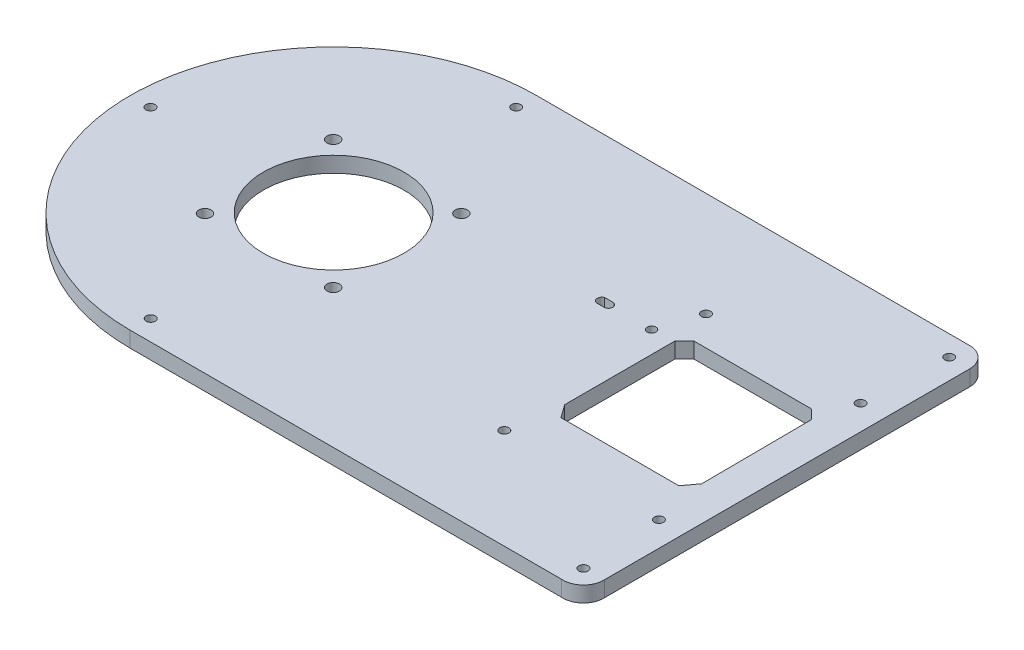
ISO-10303-21;
HEADER;
FILE_DESCRIPTION(('STEP AP214'),'2;1');
FILE_NAME('part.step','',(''),(''),'','','');
FILE_SCHEMA(('AUTOMOTIVE_DESIGN { 1 0 10303 214 1 1 1 1 }'));
ENDSEC;
DATA;
#1=APPLICATION_CONTEXT('core data for automotive mechanical design processes');
#2=APPLICATION_PROTOCOL_DEFINITION('international standard','automotive_design',2000,#1);
#3=PRODUCT_CONTEXT('',#1,'mechanical');
#4=PRODUCT('Part','Part','',(#3));
#5=PRODUCT_RELATED_PRODUCT_CATEGORY('part','',(#4));
#6=PRODUCT_DEFINITION_FORMATION('','',#4);
#7=PRODUCT_DEFINITION_CONTEXT('part definition',#1,'design');
#8=PRODUCT_DEFINITION('design','',#6,#7);
#9=PRODUCT_DEFINITION_SHAPE('','',#8);
#10=(LENGTH_UNIT() NAMED_UNIT(*) SI_UNIT(.MILLI.,.METRE.));
#11=(NAMED_UNIT(*) PLANE_ANGLE_UNIT() SI_UNIT($,.RADIAN.));
#12=(NAMED_UNIT(*) SI_UNIT($,.STERADIAN.) SOLID_ANGLE_UNIT());
#13=UNCERTAINTY_MEASURE_WITH_UNIT(LENGTH_MEASURE(1.E-05),#10,'distance_accuracy_value','');
#14=(GEOMETRIC_REPRESENTATION_CONTEXT(3) GLOBAL_UNCERTAINTY_ASSIGNED_CONTEXT((#13)) GLOBAL_UNIT_ASSIGNED_CONTEXT((#10,
#11,#12)) REPRESENTATION_CONTEXT('',''));
#15=CARTESIAN_POINT('',(0.,0.,0.));
#16=DIRECTION('',(0.,0.,1.));
#17=DIRECTION('',(1.,0.,0.));
#18=AXIS2_PLACEMENT_3D('',#15,#16,#17);
#19=CARTESIAN_POINT('',(-52.2020388860603,5.,3.91732283464572));
#20=DIRECTION('',(0.,-1.,0.));
#21=DIRECTION('',(0.,0.,-1.));
#22=AXIS2_PLACEMENT_3D('',#19,#20,#21);
#23=CYLINDRICAL_SURFACE('',#22,65.);
#24=CARTESIAN_POINT('',(-52.2020388860603,0.,3.91732283464572));
#25=DIRECTION('',(0.,1.,0.));
#26=DIRECTION('',(0.,0.,1.));
#27=AXIS2_PLACEMENT_3D('',#24,#25,#26);
#28=CIRCLE('',#27,65.);
#29=CARTESIAN_POINT('',(-52.2020388860603,0.,-61.0826771653543));
#30=VERTEX_POINT('',#29);
#31=CARTESIAN_POINT('',(-52.2020388860603,0.,68.9173228346457));
#32=VERTEX_POINT('',#31);
#33=EDGE_CURVE('E274',#30,#32,#28,.T.);
#34=ORIENTED_EDGE('',*,*,#33,.T.);
#35=DIRECTION('',(0.,-1.,0.));
#36=VECTOR('',#35,1.);
#37=CARTESIAN_POINT('',(-52.2020388860603,5.,68.9173228346457));
#38=LINE('',#37,#36);
#39=CARTESIAN_POINT('',(-52.2020388860603,5.,68.9173228346457));
#40=VERTEX_POINT('',#39);
#41=EDGE_CURVE('E11',#40,#32,#38,.T.);
#42=ORIENTED_EDGE('',*,*,#41,.F.);
#43=CARTESIAN_POINT('',(-52.2020388860603,5.,3.91732283464572));
#44=DIRECTION('',(0.,1.,0.));
#45=DIRECTION('',(0.,0.,1.));
#46=AXIS2_PLACEMENT_3D('',#43,#44,#45);
#47=CIRCLE('',#46,65.);
#48=CARTESIAN_POINT('',(-52.2020388860603,5.,-61.0826771653543));
#49=VERTEX_POINT('',#48);
#50=EDGE_CURVE('E277',#49,#40,#47,.T.);
#51=ORIENTED_EDGE('',*,*,#50,.F.);
#52=DIRECTION('',(0.,-1.,0.));
#53=VECTOR('',#52,1.);
#54=CARTESIAN_POINT('',(-52.2020388860603,5.,-61.0826771653543));
#55=LINE('',#54,#53);
#56=EDGE_CURVE('E291',#49,#30,#55,.T.);
#57=ORIENTED_EDGE('',*,*,#56,.T.);
#58=EDGE_LOOP('',(#34,#42,#51,#57));
#59=FACE_BOUND('',#58,.T.);
#60=ADVANCED_FACE('F36',(#59),#23,.T.);
#61=CARTESIAN_POINT('',(85.7979611139397,5.,68.9173228346457));
#62=DIRECTION('',(0.,0.,-1.));
#63=DIRECTION('',(-1.,0.,0.));
#64=AXIS2_PLACEMENT_3D('',#61,#62,#63);
#65=PLANE('',#64);
#66=DIRECTION('',(1.,0.,0.));
#67=VECTOR('',#66,1.);
#68=CARTESIAN_POINT('',(85.7979611139397,0.,68.9173228346457));
#69=LINE('',#68,#67);
#70=CARTESIAN_POINT('',(85.7979611139397,0.,68.9173228346457));
#71=VERTEX_POINT('',#70);
#72=EDGE_CURVE('E294',#32,#71,#69,.T.);
#73=ORIENTED_EDGE('',*,*,#72,.T.);
#74=DIRECTION('',(0.,-1.,0.));
#75=VECTOR('',#74,1.);
#76=CARTESIAN_POINT('',(85.7979611139397,5.,68.9173228346457));
#77=LINE('',#76,#75);
#78=CARTESIAN_POINT('',(85.7979611139397,5.,68.9173228346457));
#79=VERTEX_POINT('',#78);
#80=EDGE_CURVE('E43',#79,#71,#77,.T.);
#81=ORIENTED_EDGE('',*,*,#80,.F.);
#82=DIRECTION('',(1.,0.,0.));
#83=VECTOR('',#82,1.);
#84=CARTESIAN_POINT('',(85.7979611139397,5.,68.9173228346457));
#85=LINE('',#84,#83);
#86=EDGE_CURVE('E280',#40,#79,#85,.T.);
#87=ORIENTED_EDGE('',*,*,#86,.F.);
#88=ORIENTED_EDGE('',*,*,#41,.T.);
#89=EDGE_LOOP('',(#73,#81,#87,#88));
#90=FACE_BOUND('',#89,.T.);
#91=ADVANCED_FACE('F340',(#90),#65,.F.);
#92=CARTESIAN_POINT('',(86.2995932589379,5.,62.4357482206261));
#93=DIRECTION('',(0.,-1.,0.));
#94=DIRECTION('',(0.,0.,-1.));
#95=AXIS2_PLACEMENT_3D('',#92,#93,#94);
#96=CYLINDRICAL_SURFACE('',#95,6.50095718229236);
#97=CARTESIAN_POINT('',(86.2995932589379,0.,62.4357482206261));
#98=DIRECTION('',(0.,1.,0.));
#99=DIRECTION('',(0.,0.,-1.));
#100=AXIS2_PLACEMENT_3D('',#97,#98,#99);
#101=CIRCLE('',#100,6.50095718229236);
#102=CARTESIAN_POINT('',(92.7979611139396,0.,62.2522829457677));
#103=VERTEX_POINT('',#102);
#104=EDGE_CURVE('E296',#71,#103,#101,.T.);
#105=ORIENTED_EDGE('',*,*,#104,.T.);
#106=DIRECTION('',(0.,-1.,0.));
#107=VECTOR('',#106,1.);
#108=CARTESIAN_POINT('',(92.7979611139396,5.,62.2522829457677));
#109=LINE('',#108,#107);
#110=CARTESIAN_POINT('',(92.7979611139396,5.,62.2522829457677));
#111=VERTEX_POINT('',#110);
#112=EDGE_CURVE('E311',#111,#103,#109,.T.);
#113=ORIENTED_EDGE('',*,*,#112,.F.);
#114=CARTESIAN_POINT('',(86.2995932589379,5.,62.4357482206261));
#115=DIRECTION('',(0.,1.,0.));
#116=DIRECTION('',(0.,0.,-1.));
#117=AXIS2_PLACEMENT_3D('',#114,#115,#116);
#118=CIRCLE('',#117,6.50095718229236);
#119=EDGE_CURVE('E283',#79,#111,#118,.T.);
#120=ORIENTED_EDGE('',*,*,#119,.F.);
#121=ORIENTED_EDGE('',*,*,#80,.T.);
#122=EDGE_LOOP('',(#105,#113,#120,#121));
#123=FACE_BOUND('',#122,.T.);
#124=ADVANCED_FACE('F318',(#123),#96,.T.);
#125=CARTESIAN_POINT('',(92.7979611139396,5.,-54.7477170542323));
#126=DIRECTION('',(-1.,0.,0.));
#127=DIRECTION('',(0.,0.,1.));
#128=AXIS2_PLACEMENT_3D('',#125,#126,#127);
#129=PLANE('',#128);
#130=DIRECTION('',(0.,0.,-1.));
#131=VECTOR('',#130,1.);
#132=CARTESIAN_POINT('',(92.7979611139396,0.,-54.7477170542323));
#133=LINE('',#132,#131);
#134=CARTESIAN_POINT('',(92.7979611139396,0.,-54.7477170542323));
#135=VERTEX_POINT('',#134);
#136=EDGE_CURVE('E298',#103,#135,#133,.T.);
#137=ORIENTED_EDGE('',*,*,#136,.T.);
#138=DIRECTION('',(0.,-1.,0.));
#139=VECTOR('',#138,1.);
#140=CARTESIAN_POINT('',(92.7979611139396,5.,-54.7477170542323));
#141=LINE('',#140,#139);
#142=CARTESIAN_POINT('',(92.7979611139396,5.,-54.7477170542323));
#143=VERTEX_POINT('',#142);
#144=EDGE_CURVE('E308',#143,#135,#141,.T.);
#145=ORIENTED_EDGE('',*,*,#144,.F.);
#146=DIRECTION('',(0.,0.,-1.));
#147=VECTOR('',#146,1.);
#148=CARTESIAN_POINT('',(92.7979611139396,5.,-54.7477170542323));
#149=LINE('',#148,#147);
#150=EDGE_CURVE('E285',#111,#143,#149,.T.);
#151=ORIENTED_EDGE('',*,*,#150,.F.);
#152=ORIENTED_EDGE('',*,*,#112,.T.);
#153=EDGE_LOOP('',(#137,#145,#151,#152));
#154=FACE_BOUND('',#153,.T.);
#155=ADVANCED_FACE('F329',(#154),#129,.F.);
#156=CARTESIAN_POINT('',(86.299593258938,5.,-54.6020625964184));
#157=DIRECTION('',(0.,-1.,0.));
#158=DIRECTION('',(0.,0.,-1.));
#159=AXIS2_PLACEMENT_3D('',#156,#157,#158);
#160=CYLINDRICAL_SURFACE('',#159,6.50000000000001);
#161=CARTESIAN_POINT('',(86.299593258938,0.,-54.6020625964184));
#162=DIRECTION('',(0.,1.,0.));
#163=DIRECTION('',(0.,0.,-1.));
#164=AXIS2_PLACEMENT_3D('',#161,#162,#163);
#165=CIRCLE('',#164,6.50000000000001);
#166=CARTESIAN_POINT('',(85.7979611139397,0.,-61.0826771653543));
#167=VERTEX_POINT('',#166);
#168=EDGE_CURVE('E300',#135,#167,#165,.T.);
#169=ORIENTED_EDGE('',*,*,#168,.T.);
#170=DIRECTION('',(0.,-1.,0.));
#171=VECTOR('',#170,1.);
#172=CARTESIAN_POINT('',(85.7979611139397,5.,-61.0826771653543));
#173=LINE('',#172,#171);
#174=CARTESIAN_POINT('',(85.7979611139397,5.,-61.0826771653543));
#175=VERTEX_POINT('',#174);
#176=EDGE_CURVE('E305',#175,#167,#173,.T.);
#177=ORIENTED_EDGE('',*,*,#176,.F.);
#178=CARTESIAN_POINT('',(86.299593258938,5.,-54.6020625964184));
#179=DIRECTION('',(0.,1.,0.));
#180=DIRECTION('',(0.,0.,-1.));
#181=AXIS2_PLACEMENT_3D('',#178,#179,#180);
#182=CIRCLE('',#181,6.50000000000001);
#183=EDGE_CURVE('E287',#143,#175,#182,.T.);
#184=ORIENTED_EDGE('',*,*,#183,.F.);
#185=ORIENTED_EDGE('',*,*,#144,.T.);
#186=EDGE_LOOP('',(#169,#177,#184,#185));
#187=FACE_BOUND('',#186,.T.);
#188=ADVANCED_FACE('F333',(#187),#160,.T.);
#189=CARTESIAN_POINT('',(-52.2020388860603,5.,-61.0826771653543));
#190=DIRECTION('',(0.,0.,1.));
#191=DIRECTION('',(1.,0.,0.));
#192=AXIS2_PLACEMENT_3D('',#189,#190,#191);
#193=PLANE('',#192);
#194=DIRECTION('',(-1.,0.,0.));
#195=VECTOR('',#194,1.);
#196=CARTESIAN_POINT('',(-52.2020388860603,0.,-61.0826771653543));
#197=LINE('',#196,#195);
#198=EDGE_CURVE('E281',#167,#30,#197,.T.);
#199=ORIENTED_EDGE('',*,*,#198,.T.);
#200=ORIENTED_EDGE('',*,*,#56,.F.);
#201=DIRECTION('',(-1.,0.,0.));
#202=VECTOR('',#201,1.);
#203=CARTESIAN_POINT('',(-52.2020388860603,5.,-61.0826771653543));
#204=LINE('',#203,#202);
#205=EDGE_CURVE('E289',#175,#49,#204,.T.);
#206=ORIENTED_EDGE('',*,*,#205,.F.);
#207=ORIENTED_EDGE('',*,*,#176,.T.);
#208=EDGE_LOOP('',(#199,#200,#206,#207));
#209=FACE_BOUND('',#208,.T.);
#210=ADVANCED_FACE('F343',(#209),#193,.F.);
#211=CARTESIAN_POINT('',(-52.2020388860603,5.,3.91732283464572));
#212=DIRECTION('',(0.,1.,0.));
#213=DIRECTION('',(0.,0.,1.));
#214=AXIS2_PLACEMENT_3D('',#211,#212,#213);
#215=PLANE('',#214);
#216=CARTESIAN_POINT('',(84.8753715396268,5.,-27.6766639196561));
#217=DIRECTION('',(0.,1.,0.));
#218=DIRECTION('',(0.,0.,-1.));
#219=AXIS2_PLACEMENT_3D('',#216,#217,#218);
#220=CIRCLE('',#219,1.475);
#221=CARTESIAN_POINT('',(84.8753715396268,5.,-29.1516639196561));
#222=VERTEX_POINT('',#221);
#223=EDGE_CURVE('E749',#222,#222,#220,.T.);
#224=ORIENTED_EDGE('',*,*,#223,.F.);
#225=EDGE_LOOP('',(#224));
#226=FACE_BOUND('',#225,.T.);
#227=CARTESIAN_POINT('',(35.4096421433843,5.,-27.6766639196561));
#228=DIRECTION('',(0.,1.,0.));
#229=DIRECTION('',(0.,0.,1.));
#230=AXIS2_PLACEMENT_3D('',#227,#228,#229);
#231=CIRCLE('',#230,1.475);
#232=CARTESIAN_POINT('',(35.4096421433843,5.,-26.2016639196561));
#233=VERTEX_POINT('',#232);
#234=EDGE_CURVE('E753',#233,#233,#231,.T.);
#235=ORIENTED_EDGE('',*,*,#234,.F.);
#236=EDGE_LOOP('',(#235));
#237=FACE_BOUND('',#236,.T.);
#238=CARTESIAN_POINT('',(-31.529119458978,5.,24.6429681159831));
#239=DIRECTION('',(0.,1.,0.));
#240=DIRECTION('',(0.,0.,-1.));
#241=AXIS2_PLACEMENT_3D('',#238,#239,#240);
#242=CIRCLE('',#241,1.975);
#243=CARTESIAN_POINT('',(-31.529119458978,5.,22.6679681159831));
#244=VERTEX_POINT('',#243);
#245=EDGE_CURVE('E866',#244,#244,#242,.T.);
#246=ORIENTED_EDGE('',*,*,#245,.F.);
#247=EDGE_LOOP('',(#246));
#248=FACE_BOUND('',#247,.T.);
#249=CARTESIAN_POINT('',(-72.5383888478526,5.,24.6429681159831));
#250=DIRECTION('',(0.,1.,0.));
#251=DIRECTION('',(0.,0.,1.));
#252=AXIS2_PLACEMENT_3D('',#249,#250,#251);
#253=CIRCLE('',#252,1.97500000000001);
#254=CARTESIAN_POINT('',(-72.5383888478526,5.,26.6179681159831));
#255=VERTEX_POINT('',#254);
#256=EDGE_CURVE('E770',#255,#255,#253,.T.);
#257=ORIENTED_EDGE('',*,*,#256,.F.);
#258=EDGE_LOOP('',(#257));
#259=FACE_BOUND('',#258,.T.);
#260=DIRECTION('',(-0.708375142046646,0.,0.705836141133616));
#261=VECTOR('',#260,1.);
#262=CARTESIAN_POINT('',(37.9384394620157,5.,-15.2484976303887));
#263=LINE('',#262,#261);
#264=CARTESIAN_POINT('',(40.9384394620157,5.,-18.2377448494299));
#265=VERTEX_POINT('',#264);
#266=CARTESIAN_POINT('',(37.9384394620157,5.,-15.2484976303887));
#267=VERTEX_POINT('',#266);
#268=EDGE_CURVE('E50',#265,#267,#263,.T.);
#269=ORIENTED_EDGE('',*,*,#268,.F.);
#270=DIRECTION('',(-1.,0.,0.));
#271=VECTOR('',#270,1.);
#272=CARTESIAN_POINT('',(40.9384394620157,5.,-18.2377448494299));
#273=LINE('',#272,#271);
#274=CARTESIAN_POINT('',(78.6574827658638,5.,-18.2377448494299));
#275=VERTEX_POINT('',#274);
#276=EDGE_CURVE('E170',#275,#265,#273,.T.);
#277=ORIENTED_EDGE('',*,*,#276,.F.);
#278=DIRECTION('',(-0.694468442184664,0.,-0.719523163497608));
#279=VECTOR('',#278,1.);
#280=CARTESIAN_POINT('',(78.6574827658638,5.,-18.2377448494299));
#281=LINE('',#280,#279);
#282=CARTESIAN_POINT('',(81.5426405548378,5.,-15.2484976303887));
#283=VERTEX_POINT('',#282);
#284=EDGE_CURVE('E175',#283,#275,#281,.T.);
#285=ORIENTED_EDGE('',*,*,#284,.F.);
#286=DIRECTION('',(-0.00650489892875077,0.,-0.999978842921152));
#287=VECTOR('',#286,1.);
#288=CARTESIAN_POINT('',(81.5426405548378,5.,-15.2484976303887));
#289=LINE('',#288,#287);
#290=CARTESIAN_POINT('',(81.7723249768897,5.,20.0602081798352));
#291=VERTEX_POINT('',#290);
#292=EDGE_CURVE('E784',#291,#283,#289,.T.);
#293=ORIENTED_EDGE('',*,*,#292,.F.);
#294=DIRECTION('',(0.595500929355019,0.,-0.803354618544829));
#295=VECTOR('',#294,1.);
#296=CARTESIAN_POINT('',(81.7723249768897,5.,20.0602081798352));
#297=LINE('',#296,#295);
#298=CARTESIAN_POINT('',(78.6574827658638,5.,24.2622551505701));
#299=VERTEX_POINT('',#298);
#300=EDGE_CURVE('E787',#299,#291,#297,.T.);
#301=ORIENTED_EDGE('',*,*,#300,.F.);
#302=DIRECTION('',(1.,0.,0.));
#303=VECTOR('',#302,1.);
#304=CARTESIAN_POINT('',(40.9384394620156,5.,24.2622551505701));
#305=LINE('',#304,#303);
#306=CARTESIAN_POINT('',(40.9384394620156,5.,24.2622551505701));
#307=VERTEX_POINT('',#306);
#308=EDGE_CURVE('E790',#307,#299,#305,.T.);
#309=ORIENTED_EDGE('',*,*,#308,.F.);
#310=DIRECTION('',(0.581050661261784,0.,0.813867390332875));
#311=VECTOR('',#310,1.);
#312=CARTESIAN_POINT('',(40.9384394620156,5.,24.2622551505701));
#313=LINE('',#312,#311);
#314=CARTESIAN_POINT('',(37.9384394620157,5.,20.0602081798352));
#315=VERTEX_POINT('',#314);
#316=EDGE_CURVE('E186',#315,#307,#313,.T.);
#317=ORIENTED_EDGE('',*,*,#316,.F.);
#318=DIRECTION('',(0.,0.,1.));
#319=VECTOR('',#318,1.);
#320=CARTESIAN_POINT('',(37.9384394620157,5.,-15.2484976303887));
#321=LINE('',#320,#319);
#322=EDGE_CURVE('E182',#267,#315,#321,.T.);
#323=ORIENTED_EDGE('',*,*,#322,.F.);
#324=EDGE_LOOP('',(#269,#277,#285,#293,#301,#309,#317,#323));
#325=FACE_BOUND('',#324,.T.);
#326=CARTESIAN_POINT('',(-52.2020388860603,5.,3.82202397280545));
#327=DIRECTION('',(0.,1.,0.));
#328=DIRECTION('',(0.,0.,1.));
#329=AXIS2_PLACEMENT_3D('',#326,#327,#328);
#330=CIRCLE('',#329,22.5);
#331=CARTESIAN_POINT('',(-52.2020388860603,5.,26.3220239728055));
#332=VERTEX_POINT('',#331);
#333=EDGE_CURVE('E167',#332,#332,#330,.T.);
#334=ORIENTED_EDGE('',*,*,#333,.F.);
#335=EDGE_LOOP('',(#334));
#336=FACE_BOUND('',#335,.T.);
#337=CARTESIAN_POINT('',(-72.5387541534153,5.,-16.3670318823898));
#338=DIRECTION('',(0.,1.,0.));
#339=DIRECTION('',(0.,0.,1.));
#340=AXIS2_PLACEMENT_3D('',#337,#338,#339);
#341=CIRCLE('',#340,1.97500000000001);
#342=CARTESIAN_POINT('',(-72.5387541534153,5.,-14.3920318823898));
#343=VERTEX_POINT('',#342);
#344=EDGE_CURVE('E217',#343,#343,#341,.T.);
#345=ORIENTED_EDGE('',*,*,#344,.F.);
#346=EDGE_LOOP('',(#345));
#347=FACE_BOUND('',#346,.T.);
#348=CARTESIAN_POINT('',(31.0479611139397,5.,-14.6279760271946));
#349=DIRECTION('',(0.,1.,0.));
#350=DIRECTION('',(0.,0.,1.));
#351=AXIS2_PLACEMENT_3D('',#348,#349,#350);
#352=CIRCLE('',#351,1.39999999999999);
#353=CARTESIAN_POINT('',(31.0479611139397,5.,-13.2279760271946));
#354=VERTEX_POINT('',#353);
#355=EDGE_CURVE('E764',#354,#354,#352,.T.);
#356=ORIENTED_EDGE('',*,*,#355,.F.);
#357=EDGE_LOOP('',(#356));
#358=FACE_BOUND('',#357,.T.);
#359=CARTESIAN_POINT('',(84.8753715396268,5.,36.8488392095397));
#360=DIRECTION('',(0.,1.,0.));
#361=DIRECTION('',(0.,0.,1.));
#362=AXIS2_PLACEMENT_3D('',#359,#360,#361);
#363=CIRCLE('',#362,1.475);
#364=CARTESIAN_POINT('',(84.8753715396268,5.,38.3238392095397));
#365=VERTEX_POINT('',#364);
#366=EDGE_CURVE('E755',#365,#365,#363,.T.);
#367=ORIENTED_EDGE('',*,*,#366,.F.);
#368=EDGE_LOOP('',(#367));
#369=FACE_BOUND('',#368,.T.);
#370=CARTESIAN_POINT('',(35.4096421433843,5.,36.8488392095397));
#371=DIRECTION('',(0.,1.,0.));
#372=DIRECTION('',(0.,0.,-1.));
#373=AXIS2_PLACEMENT_3D('',#370,#371,#372);
#374=CIRCLE('',#373,1.475);
#375=CARTESIAN_POINT('',(35.4096421433843,5.,35.3738392095398));
#376=VERTEX_POINT('',#375);
#377=EDGE_CURVE('E886',#376,#376,#374,.T.);
#378=ORIENTED_EDGE('',*,*,#377,.F.);
#379=EDGE_LOOP('',(#378));
#380=FACE_BOUND('',#379,.T.);
#381=CARTESIAN_POINT('',(-31.5287541534153,5.,-16.3670318823899));
#382=DIRECTION('',(0.,1.,0.));
#383=DIRECTION('',(0.,0.,-1.));
#384=AXIS2_PLACEMENT_3D('',#381,#382,#383);
#385=CIRCLE('',#384,1.975);
#386=CARTESIAN_POINT('',(-31.5287541534153,5.,-18.3420318823899));
#387=VERTEX_POINT('',#386);
#388=EDGE_CURVE('E855',#387,#387,#385,.T.);
#389=ORIENTED_EDGE('',*,*,#388,.F.);
#390=EDGE_LOOP('',(#389));
#391=FACE_BOUND('',#390,.T.);
#392=CARTESIAN_POINT('',(17.235221732455,5.,-14.6279760271946));
#393=DIRECTION('',(0.,1.,0.));
#394=DIRECTION('',(0.,0.,-1.));
#395=AXIS2_PLACEMENT_3D('',#392,#393,#394);
#396=CIRCLE('',#395,1.41607134157657);
#397=CARTESIAN_POINT('',(17.4479611139397,5.,-13.2279760271946));
#398=VERTEX_POINT('',#397);
#399=CARTESIAN_POINT('',(17.4479611139397,5.,-16.0279760271946));
#400=VERTEX_POINT('',#399);
#401=EDGE_CURVE('E58',#398,#400,#396,.T.);
#402=ORIENTED_EDGE('',*,*,#401,.F.);
#403=DIRECTION('',(1.,0.,0.));
#404=VECTOR('',#403,1.);
#405=CARTESIAN_POINT('',(17.4479611139397,5.,-13.2279760271946));
#406=LINE('',#405,#404);
#407=CARTESIAN_POINT('',(14.6479611139397,5.,-13.2279760271946));
#408=VERTEX_POINT('',#407);
#409=EDGE_CURVE('E222',#408,#398,#406,.T.);
#410=ORIENTED_EDGE('',*,*,#409,.F.);
#411=CARTESIAN_POINT('',(15.1916657780671,5.,-14.6279760271946));
#412=DIRECTION('',(0.,1.,0.));
#413=DIRECTION('',(0.,0.,1.));
#414=AXIS2_PLACEMENT_3D('',#411,#412,#413);
#415=CIRCLE('',#414,1.50187042110624);
#416=CARTESIAN_POINT('',(14.6479611139397,5.,-16.0279760271946));
#417=VERTEX_POINT('',#416);
#418=EDGE_CURVE('E234',#417,#408,#415,.T.);
#419=ORIENTED_EDGE('',*,*,#418,.F.);
#420=DIRECTION('',(-1.,0.,0.));
#421=VECTOR('',#420,1.);
#422=CARTESIAN_POINT('',(17.4479611139397,5.,-16.0279760271945));
#423=LINE('',#422,#421);
#424=EDGE_CURVE('E184',#400,#417,#423,.T.);
#425=ORIENTED_EDGE('',*,*,#424,.F.);
#426=EDGE_LOOP('',(#402,#410,#419,#425));
#427=FACE_BOUND('',#426,.T.);
#428=CARTESIAN_POINT('',(-52.1101684414819,5.,62.4173228346457));
#429=DIRECTION('',(0.,1.,0.));
#430=DIRECTION('',(0.,0.,-1.));
#431=AXIS2_PLACEMENT_3D('',#428,#429,#430);
#432=CIRCLE('',#431,1.475);
#433=CARTESIAN_POINT('',(-52.1101684414819,5.,60.9423228346457));
#434=VERTEX_POINT('',#433);
#435=EDGE_CURVE('E266',#434,#434,#432,.T.);
#436=ORIENTED_EDGE('',*,*,#435,.F.);
#437=EDGE_LOOP('',(#436));
#438=FACE_BOUND('',#437,.T.);
#439=CARTESIAN_POINT('',(86.2979611139396,5.,62.4173228346457));
#440=DIRECTION('',(0.,1.,0.));
#441=DIRECTION('',(0.,0.,-1.));
#442=AXIS2_PLACEMENT_3D('',#439,#440,#441);
#443=CIRCLE('',#442,1.475);
#444=CARTESIAN_POINT('',(86.2979611139396,5.,60.9423228346457));
#445=VERTEX_POINT('',#444);
#446=EDGE_CURVE('E260',#445,#445,#443,.T.);
#447=ORIENTED_EDGE('',*,*,#446,.F.);
#448=EDGE_LOOP('',(#447));
#449=FACE_BOUND('',#448,.T.);
#450=CARTESIAN_POINT('',(-110.70203888606,5.,3.91221445713284));
#451=DIRECTION('',(0.,1.,0.));
#452=DIRECTION('',(0.,0.,1.));
#453=AXIS2_PLACEMENT_3D('',#450,#451,#452);
#454=CIRCLE('',#453,1.475);
#455=CARTESIAN_POINT('',(-110.70203888606,5.,5.38721445713284));
#456=VERTEX_POINT('',#455);
#457=EDGE_CURVE('E254',#456,#456,#454,.T.);
#458=ORIENTED_EDGE('',*,*,#457,.F.);
#459=EDGE_LOOP('',(#458));
#460=FACE_BOUND('',#459,.T.);
#461=CARTESIAN_POINT('',(-52.2020388860604,5.,-54.5826771653543));
#462=DIRECTION('',(0.,1.,0.));
#463=DIRECTION('',(0.,0.,1.));
#464=AXIS2_PLACEMENT_3D('',#461,#462,#463);
#465=CIRCLE('',#464,1.475);
#466=CARTESIAN_POINT('',(-52.2020388860604,5.,-53.1076771653543));
#467=VERTEX_POINT('',#466);
#468=EDGE_CURVE('E247',#467,#467,#465,.T.);
#469=ORIENTED_EDGE('',*,*,#468,.F.);
#470=EDGE_LOOP('',(#469));
#471=FACE_BOUND('',#470,.T.);
#472=CARTESIAN_POINT('',(86.2979611139396,5.,-54.5826771653543));
#473=DIRECTION('',(0.,1.,0.));
#474=DIRECTION('',(0.,0.,1.));
#475=AXIS2_PLACEMENT_3D('',#472,#473,#474);
#476=CIRCLE('',#475,1.475);
#477=CARTESIAN_POINT('',(86.2979611139396,5.,-53.1076771653543));
#478=VERTEX_POINT('',#477);
#479=EDGE_CURVE('E250',#478,#478,#476,.T.);
#480=ORIENTED_EDGE('',*,*,#479,.F.);
#481=EDGE_LOOP('',(#480));
#482=FACE_BOUND('',#481,.T.);
#483=ORIENTED_EDGE('',*,*,#50,.T.);
#484=ORIENTED_EDGE('',*,*,#86,.T.);
#485=ORIENTED_EDGE('',*,*,#119,.T.);
#486=ORIENTED_EDGE('',*,*,#150,.T.);
#487=ORIENTED_EDGE('',*,*,#183,.T.);
#488=ORIENTED_EDGE('',*,*,#205,.T.);
#489=EDGE_LOOP('',(#483,#484,#485,#486,#487,#488));
#490=FACE_BOUND('',#489,.T.);
#491=ADVANCED_FACE('F178',(#226,#237,#248,#259,#325,#336,#347,#358,#369,#380,#391,#427,#438,
#449,#460,#471,#482,#490),#215,.T.);
#492=CARTESIAN_POINT('',(-52.2020388860603,0.,3.91732283464572));
#493=DIRECTION('',(0.,1.,0.));
#494=DIRECTION('',(0.,0.,1.));
#495=AXIS2_PLACEMENT_3D('',#492,#493,#494);
#496=PLANE('',#495);
#497=CARTESIAN_POINT('',(84.8753715396268,0.,-27.6766639196561));
#498=DIRECTION('',(0.,1.,0.));
#499=DIRECTION('',(0.,0.,-1.));
#500=AXIS2_PLACEMENT_3D('',#497,#498,#499);
#501=CIRCLE('',#500,1.475);
#502=CARTESIAN_POINT('',(84.8753715396268,0.,-29.1516639196561));
#503=VERTEX_POINT('',#502);
#504=EDGE_CURVE('E746',#503,#503,#501,.T.);
#505=ORIENTED_EDGE('',*,*,#504,.T.);
#506=EDGE_LOOP('',(#505));
#507=FACE_BOUND('',#506,.T.);
#508=CARTESIAN_POINT('',(35.4096421433843,0.,-27.6766639196561));
#509=DIRECTION('',(0.,1.,0.));
#510=DIRECTION('',(0.,0.,1.));
#511=AXIS2_PLACEMENT_3D('',#508,#509,#510);
#512=CIRCLE('',#511,1.475);
#513=CARTESIAN_POINT('',(35.4096421433843,0.,-26.2016639196561));
#514=VERTEX_POINT('',#513);
#515=EDGE_CURVE('E750',#514,#514,#512,.T.);
#516=ORIENTED_EDGE('',*,*,#515,.T.);
#517=EDGE_LOOP('',(#516));
#518=FACE_BOUND('',#517,.T.);
#519=CARTESIAN_POINT('',(-31.529119458978,0.,24.6429681159831));
#520=DIRECTION('',(0.,1.,0.));
#521=DIRECTION('',(0.,0.,-1.));
#522=AXIS2_PLACEMENT_3D('',#519,#520,#521);
#523=CIRCLE('',#522,1.975);
#524=CARTESIAN_POINT('',(-31.529119458978,0.,22.6679681159831));
#525=VERTEX_POINT('',#524);
#526=EDGE_CURVE('E869',#525,#525,#523,.T.);
#527=ORIENTED_EDGE('',*,*,#526,.T.);
#528=EDGE_LOOP('',(#527));
#529=FACE_BOUND('',#528,.T.);
#530=CARTESIAN_POINT('',(-72.5383888478526,0.,24.6429681159831));
#531=DIRECTION('',(0.,1.,0.));
#532=DIRECTION('',(0.,0.,1.));
#533=AXIS2_PLACEMENT_3D('',#530,#531,#532);
#534=CIRCLE('',#533,1.97500000000001);
#535=CARTESIAN_POINT('',(-72.5383888478526,0.,26.6179681159831));
#536=VERTEX_POINT('',#535);
#537=EDGE_CURVE('E863',#536,#536,#534,.T.);
#538=ORIENTED_EDGE('',*,*,#537,.T.);
#539=EDGE_LOOP('',(#538));
#540=FACE_BOUND('',#539,.T.);
#541=DIRECTION('',(-1.,0.,0.));
#542=VECTOR('',#541,1.);
#543=CARTESIAN_POINT('',(40.9384394620157,0.,-18.2377448494299));
#544=LINE('',#543,#542);
#545=CARTESIAN_POINT('',(78.6574827658638,0.,-18.2377448494299));
#546=VERTEX_POINT('',#545);
#547=CARTESIAN_POINT('',(40.9384394620157,0.,-18.2377448494299));
#548=VERTEX_POINT('',#547);
#549=EDGE_CURVE('E190',#546,#548,#544,.T.);
#550=ORIENTED_EDGE('',*,*,#549,.T.);
#551=DIRECTION('',(-0.708375142046646,0.,0.705836141133616));
#552=VECTOR('',#551,1.);
#553=CARTESIAN_POINT('',(37.9384394620157,0.,-15.2484976303887));
#554=LINE('',#553,#552);
#555=CARTESIAN_POINT('',(37.9384394620157,0.,-15.2484976303887));
#556=VERTEX_POINT('',#555);
#557=EDGE_CURVE('E162',#548,#556,#554,.T.);
#558=ORIENTED_EDGE('',*,*,#557,.T.);
#559=DIRECTION('',(0.,0.,1.));
#560=VECTOR('',#559,1.);
#561=CARTESIAN_POINT('',(37.9384394620157,0.,-15.2484976303887));
#562=LINE('',#561,#560);
#563=CARTESIAN_POINT('',(37.9384394620157,0.,20.0602081798352));
#564=VERTEX_POINT('',#563);
#565=EDGE_CURVE('E208',#556,#564,#562,.T.);
#566=ORIENTED_EDGE('',*,*,#565,.T.);
#567=DIRECTION('',(0.581050661261784,0.,0.813867390332875));
#568=VECTOR('',#567,1.);
#569=CARTESIAN_POINT('',(40.9384394620156,0.,24.2622551505701));
#570=LINE('',#569,#568);
#571=CARTESIAN_POINT('',(40.9384394620156,0.,24.2622551505701));
#572=VERTEX_POINT('',#571);
#573=EDGE_CURVE('E205',#564,#572,#570,.T.);
#574=ORIENTED_EDGE('',*,*,#573,.T.);
#575=DIRECTION('',(1.,0.,0.));
#576=VECTOR('',#575,1.);
#577=CARTESIAN_POINT('',(40.9384394620156,0.,24.2622551505701));
#578=LINE('',#577,#576);
#579=CARTESIAN_POINT('',(78.6574827658638,0.,24.2622551505701));
#580=VERTEX_POINT('',#579);
#581=EDGE_CURVE('E202',#572,#580,#578,.T.);
#582=ORIENTED_EDGE('',*,*,#581,.T.);
#583=DIRECTION('',(0.595500929355019,0.,-0.803354618544829));
#584=VECTOR('',#583,1.);
#585=CARTESIAN_POINT('',(81.7723249768897,0.,20.0602081798352));
#586=LINE('',#585,#584);
#587=CARTESIAN_POINT('',(81.7723249768897,0.,20.0602081798352));
#588=VERTEX_POINT('',#587);
#589=EDGE_CURVE('E199',#580,#588,#586,.T.);
#590=ORIENTED_EDGE('',*,*,#589,.T.);
#591=DIRECTION('',(-0.00650489892875077,0.,-0.999978842921152));
#592=VECTOR('',#591,1.);
#593=CARTESIAN_POINT('',(81.5426405548378,0.,-15.2484976303887));
#594=LINE('',#593,#592);
#595=CARTESIAN_POINT('',(81.5426405548378,0.,-15.2484976303887));
#596=VERTEX_POINT('',#595);
#597=EDGE_CURVE('E196',#588,#596,#594,.T.);
#598=ORIENTED_EDGE('',*,*,#597,.T.);
#599=DIRECTION('',(-0.694468442184664,0.,-0.719523163497608));
#600=VECTOR('',#599,1.);
#601=CARTESIAN_POINT('',(78.6574827658638,0.,-18.2377448494299));
#602=LINE('',#601,#600);
#603=EDGE_CURVE('E192',#596,#546,#602,.T.);
#604=ORIENTED_EDGE('',*,*,#603,.T.);
#605=EDGE_LOOP('',(#550,#558,#566,#574,#582,#590,#598,#604));
#606=FACE_BOUND('',#605,.T.);
#607=CARTESIAN_POINT('',(-52.2020388860603,0.,3.82202397280545));
#608=DIRECTION('',(0.,1.,0.));
#609=DIRECTION('',(0.,0.,1.));
#610=AXIS2_PLACEMENT_3D('',#607,#608,#609);
#611=CIRCLE('',#610,22.5);
#612=CARTESIAN_POINT('',(-52.2020388860603,0.,26.3220239728055));
#613=VERTEX_POINT('',#612);
#614=EDGE_CURVE('E214',#613,#613,#611,.T.);
#615=ORIENTED_EDGE('',*,*,#614,.T.);
#616=EDGE_LOOP('',(#615));
#617=FACE_BOUND('',#616,.T.);
#618=CARTESIAN_POINT('',(-72.5387541534153,0.,-16.3670318823898));
#619=DIRECTION('',(0.,1.,0.));
#620=DIRECTION('',(0.,0.,1.));
#621=AXIS2_PLACEMENT_3D('',#618,#619,#620);
#622=CIRCLE('',#621,1.97500000000001);
#623=CARTESIAN_POINT('',(-72.5387541534153,0.,-14.3920318823898));
#624=VERTEX_POINT('',#623);
#625=EDGE_CURVE('E761',#624,#624,#622,.T.);
#626=ORIENTED_EDGE('',*,*,#625,.T.);
#627=EDGE_LOOP('',(#626));
#628=FACE_BOUND('',#627,.T.);
#629=CARTESIAN_POINT('',(31.0479611139397,0.,-14.6279760271946));
#630=DIRECTION('',(0.,1.,0.));
#631=DIRECTION('',(0.,0.,1.));
#632=AXIS2_PLACEMENT_3D('',#629,#630,#631);
#633=CIRCLE('',#632,1.39999999999999);
#634=CARTESIAN_POINT('',(31.0479611139397,0.,-13.2279760271946));
#635=VERTEX_POINT('',#634);
#636=EDGE_CURVE('E767',#635,#635,#633,.T.);
#637=ORIENTED_EDGE('',*,*,#636,.T.);
#638=EDGE_LOOP('',(#637));
#639=FACE_BOUND('',#638,.T.);
#640=CARTESIAN_POINT('',(84.8753715396268,0.,36.8488392095397));
#641=DIRECTION('',(0.,1.,0.));
#642=DIRECTION('',(0.,0.,1.));
#643=AXIS2_PLACEMENT_3D('',#640,#641,#642);
#644=CIRCLE('',#643,1.475);
#645=CARTESIAN_POINT('',(84.8753715396268,0.,38.3238392095397));
#646=VERTEX_POINT('',#645);
#647=EDGE_CURVE('E813',#646,#646,#644,.T.);
#648=ORIENTED_EDGE('',*,*,#647,.T.);
#649=EDGE_LOOP('',(#648));
#650=FACE_BOUND('',#649,.T.);
#651=CARTESIAN_POINT('',(35.4096421433843,0.,36.8488392095397));
#652=DIRECTION('',(0.,1.,0.));
#653=DIRECTION('',(0.,0.,-1.));
#654=AXIS2_PLACEMENT_3D('',#651,#652,#653);
#655=CIRCLE('',#654,1.475);
#656=CARTESIAN_POINT('',(35.4096421433843,0.,35.3738392095398));
#657=VERTEX_POINT('',#656);
#658=EDGE_CURVE('E817',#657,#657,#655,.T.);
#659=ORIENTED_EDGE('',*,*,#658,.T.);
#660=EDGE_LOOP('',(#659));
#661=FACE_BOUND('',#660,.T.);
#662=CARTESIAN_POINT('',(-31.5287541534153,0.,-16.3670318823899));
#663=DIRECTION('',(0.,1.,0.));
#664=DIRECTION('',(0.,0.,-1.));
#665=AXIS2_PLACEMENT_3D('',#662,#663,#664);
#666=CIRCLE('',#665,1.975);
#667=CARTESIAN_POINT('',(-31.5287541534153,0.,-18.3420318823899));
#668=VERTEX_POINT('',#667);
#669=EDGE_CURVE('E821',#668,#668,#666,.T.);
#670=ORIENTED_EDGE('',*,*,#669,.T.);
#671=EDGE_LOOP('',(#670));
#672=FACE_BOUND('',#671,.T.);
#673=DIRECTION('',(1.,0.,0.));
#674=VECTOR('',#673,1.);
#675=CARTESIAN_POINT('',(17.4479611139397,0.,-13.2279760271946));
#676=LINE('',#675,#674);
#677=CARTESIAN_POINT('',(14.6479611139397,0.,-13.2279760271946));
#678=VERTEX_POINT('',#677);
#679=CARTESIAN_POINT('',(17.4479611139397,0.,-13.2279760271946));
#680=VERTEX_POINT('',#679);
#681=EDGE_CURVE('E228',#678,#680,#676,.T.);
#682=ORIENTED_EDGE('',*,*,#681,.T.);
#683=CARTESIAN_POINT('',(17.235221732455,0.,-14.6279760271946));
#684=DIRECTION('',(0.,1.,0.));
#685=DIRECTION('',(0.,0.,-1.));
#686=AXIS2_PLACEMENT_3D('',#683,#684,#685);
#687=CIRCLE('',#686,1.41607134157657);
#688=CARTESIAN_POINT('',(17.4479611139397,0.,-16.0279760271945));
#689=VERTEX_POINT('',#688);
#690=EDGE_CURVE('E218',#680,#689,#687,.T.);
#691=ORIENTED_EDGE('',*,*,#690,.T.);
#692=DIRECTION('',(-1.,0.,0.));
#693=VECTOR('',#692,1.);
#694=CARTESIAN_POINT('',(17.4479611139397,0.,-16.0279760271945));
#695=LINE('',#694,#693);
#696=CARTESIAN_POINT('',(14.6479611139397,0.,-16.0279760271946));
#697=VERTEX_POINT('',#696);
#698=EDGE_CURVE('E221',#689,#697,#695,.T.);
#699=ORIENTED_EDGE('',*,*,#698,.T.);
#700=CARTESIAN_POINT('',(15.1916657780671,0.,-14.6279760271946));
#701=DIRECTION('',(0.,1.,0.));
#702=DIRECTION('',(0.,0.,1.));
#703=AXIS2_PLACEMENT_3D('',#700,#701,#702);
#704=CIRCLE('',#703,1.50187042110624);
#705=EDGE_CURVE('E225',#697,#678,#704,.T.);
#706=ORIENTED_EDGE('',*,*,#705,.T.);
#707=EDGE_LOOP('',(#682,#691,#699,#706));
#708=FACE_BOUND('',#707,.T.);
#709=CARTESIAN_POINT('',(-52.1101684414819,0.,62.4173228346457));
#710=DIRECTION('',(0.,1.,0.));
#711=DIRECTION('',(0.,0.,-1.));
#712=AXIS2_PLACEMENT_3D('',#709,#710,#711);
#713=CIRCLE('',#712,1.475);
#714=CARTESIAN_POINT('',(-52.1101684414819,0.,60.9423228346457));
#715=VERTEX_POINT('',#714);
#716=EDGE_CURVE('E241',#715,#715,#713,.T.);
#717=ORIENTED_EDGE('',*,*,#716,.T.);
#718=EDGE_LOOP('',(#717));
#719=FACE_BOUND('',#718,.T.);
#720=CARTESIAN_POINT('',(86.2979611139396,0.,62.4173228346457));
#721=DIRECTION('',(0.,1.,0.));
#722=DIRECTION('',(0.,0.,-1.));
#723=AXIS2_PLACEMENT_3D('',#720,#721,#722);
#724=CIRCLE('',#723,1.475);
#725=CARTESIAN_POINT('',(86.2979611139396,0.,60.9423228346457));
#726=VERTEX_POINT('',#725);
#727=EDGE_CURVE('E263',#726,#726,#724,.T.);
#728=ORIENTED_EDGE('',*,*,#727,.T.);
#729=EDGE_LOOP('',(#728));
#730=FACE_BOUND('',#729,.T.);
#731=CARTESIAN_POINT('',(-110.70203888606,0.,3.91221445713284));
#732=DIRECTION('',(0.,1.,0.));
#733=DIRECTION('',(0.,0.,1.));
#734=AXIS2_PLACEMENT_3D('',#731,#732,#733);
#735=CIRCLE('',#734,1.475);
#736=CARTESIAN_POINT('',(-110.70203888606,0.,5.38721445713284));
#737=VERTEX_POINT('',#736);
#738=EDGE_CURVE('E257',#737,#737,#735,.T.);
#739=ORIENTED_EDGE('',*,*,#738,.T.);
#740=EDGE_LOOP('',(#739));
#741=FACE_BOUND('',#740,.T.);
#742=CARTESIAN_POINT('',(-52.2020388860604,0.,-54.5826771653543));
#743=DIRECTION('',(0.,1.,0.));
#744=DIRECTION('',(0.,0.,1.));
#745=AXIS2_PLACEMENT_3D('',#742,#743,#744);
#746=CIRCLE('',#745,1.475);
#747=CARTESIAN_POINT('',(-52.2020388860604,0.,-53.1076771653543));
#748=VERTEX_POINT('',#747);
#749=EDGE_CURVE('E251',#748,#748,#746,.T.);
#750=ORIENTED_EDGE('',*,*,#749,.T.);
#751=EDGE_LOOP('',(#750));
#752=FACE_BOUND('',#751,.T.);
#753=CARTESIAN_POINT('',(86.2979611139396,0.,-54.5826771653543));
#754=DIRECTION('',(0.,1.,0.));
#755=DIRECTION('',(0.,0.,1.));
#756=AXIS2_PLACEMENT_3D('',#753,#754,#755);
#757=CIRCLE('',#756,1.475);
#758=CARTESIAN_POINT('',(86.2979611139396,0.,-53.1076771653543));
#759=VERTEX_POINT('',#758);
#760=EDGE_CURVE('E271',#759,#759,#757,.T.);
#761=ORIENTED_EDGE('',*,*,#760,.T.);
#762=EDGE_LOOP('',(#761));
#763=FACE_BOUND('',#762,.T.);
#764=ORIENTED_EDGE('',*,*,#33,.F.);
#765=ORIENTED_EDGE('',*,*,#198,.F.);
#766=ORIENTED_EDGE('',*,*,#168,.F.);
#767=ORIENTED_EDGE('',*,*,#136,.F.);
#768=ORIENTED_EDGE('',*,*,#104,.F.);
#769=ORIENTED_EDGE('',*,*,#72,.F.);
#770=EDGE_LOOP('',(#764,#765,#766,#767,#768,#769));
#771=FACE_BOUND('',#770,.T.);
#772=ADVANCED_FACE('F324',(#507,#518,#529,#540,#606,#617,#628,#639,#650,#661,#672,#708,#719,
#730,#741,#752,#763,#771),#496,.F.);
#773=CARTESIAN_POINT('',(86.2979611139396,0.,-54.5826771653543));
#774=DIRECTION('',(0.,1.,0.));
#775=DIRECTION('',(0.,0.,1.));
#776=AXIS2_PLACEMENT_3D('',#773,#774,#775);
#777=CYLINDRICAL_SURFACE('',#776,1.475);
#778=ORIENTED_EDGE('',*,*,#760,.F.);
#779=EDGE_LOOP('',(#778));
#780=FACE_BOUND('',#779,.T.);
#781=ORIENTED_EDGE('',*,*,#479,.T.);
#782=EDGE_LOOP('',(#781));
#783=FACE_BOUND('',#782,.T.);
#784=ADVANCED_FACE('F384',(#780,#783),#777,.F.);
#785=CARTESIAN_POINT('',(-52.2020388860604,0.,-54.5826771653543));
#786=DIRECTION('',(0.,1.,0.));
#787=DIRECTION('',(0.,0.,1.));
#788=AXIS2_PLACEMENT_3D('',#785,#786,#787);
#789=CYLINDRICAL_SURFACE('',#788,1.475);
#790=ORIENTED_EDGE('',*,*,#749,.F.);
#791=EDGE_LOOP('',(#790));
#792=FACE_BOUND('',#791,.T.);
#793=ORIENTED_EDGE('',*,*,#468,.T.);
#794=EDGE_LOOP('',(#793));
#795=FACE_BOUND('',#794,.T.);
#796=ADVANCED_FACE('F389',(#792,#795),#789,.F.);
#797=CARTESIAN_POINT('',(-110.70203888606,0.,3.91221445713284));
#798=DIRECTION('',(0.,1.,0.));
#799=DIRECTION('',(0.,0.,1.));
#800=AXIS2_PLACEMENT_3D('',#797,#798,#799);
#801=CYLINDRICAL_SURFACE('',#800,1.475);
#802=ORIENTED_EDGE('',*,*,#738,.F.);
#803=EDGE_LOOP('',(#802));
#804=FACE_BOUND('',#803,.T.);
#805=ORIENTED_EDGE('',*,*,#457,.T.);
#806=EDGE_LOOP('',(#805));
#807=FACE_BOUND('',#806,.T.);
#808=ADVANCED_FACE('F402',(#804,#807),#801,.F.);
#809=CARTESIAN_POINT('',(86.2979611139396,0.,62.4173228346457));
#810=DIRECTION('',(0.,1.,0.));
#811=DIRECTION('',(0.,0.,1.));
#812=AXIS2_PLACEMENT_3D('',#809,#810,#811);
#813=CYLINDRICAL_SURFACE('',#812,1.475);
#814=ORIENTED_EDGE('',*,*,#727,.F.);
#815=EDGE_LOOP('',(#814));
#816=FACE_BOUND('',#815,.T.);
#817=ORIENTED_EDGE('',*,*,#446,.T.);
#818=EDGE_LOOP('',(#817));
#819=FACE_BOUND('',#818,.T.);
#820=ADVANCED_FACE('F413',(#816,#819),#813,.F.);
#821=CARTESIAN_POINT('',(-52.1101684414819,0.,62.4173228346457));
#822=DIRECTION('',(0.,1.,0.));
#823=DIRECTION('',(0.,0.,1.));
#824=AXIS2_PLACEMENT_3D('',#821,#822,#823);
#825=CYLINDRICAL_SURFACE('',#824,1.475);
#826=ORIENTED_EDGE('',*,*,#716,.F.);
#827=EDGE_LOOP('',(#826));
#828=FACE_BOUND('',#827,.T.);
#829=ORIENTED_EDGE('',*,*,#435,.T.);
#830=EDGE_LOOP('',(#829));
#831=FACE_BOUND('',#830,.T.);
#832=ADVANCED_FACE('F424',(#828,#831),#825,.F.);
#833=CARTESIAN_POINT('',(17.235221732455,0.,-14.6279760271946));
#834=DIRECTION('',(0.,1.,0.));
#835=DIRECTION('',(0.,0.,1.));
#836=AXIS2_PLACEMENT_3D('',#833,#834,#835);
#837=CYLINDRICAL_SURFACE('',#836,1.41607134157657);
#838=ORIENTED_EDGE('',*,*,#401,.T.);
#839=DIRECTION('',(0.,1.,0.));
#840=VECTOR('',#839,1.);
#841=CARTESIAN_POINT('',(17.4479611139397,0.,-16.0279760271945));
#842=LINE('',#841,#840);
#843=EDGE_CURVE('E230',#689,#400,#842,.T.);
#844=ORIENTED_EDGE('',*,*,#843,.F.);
#845=ORIENTED_EDGE('',*,*,#690,.F.);
#846=DIRECTION('',(0.,1.,0.));
#847=VECTOR('',#846,1.);
#848=CARTESIAN_POINT('',(17.4479611139397,0.,-13.2279760271946));
#849=LINE('',#848,#847);
#850=EDGE_CURVE('E239',#680,#398,#849,.T.);
#851=ORIENTED_EDGE('',*,*,#850,.T.);
#852=EDGE_LOOP('',(#838,#844,#845,#851));
#853=FACE_BOUND('',#852,.T.);
#854=ADVANCED_FACE('F435',(#853),#837,.F.);
#855=CARTESIAN_POINT('',(17.4479611139397,0.,-13.2279760271946));
#856=DIRECTION('',(0.,0.,1.));
#857=DIRECTION('',(1.,0.,0.));
#858=AXIS2_PLACEMENT_3D('',#855,#856,#857);
#859=PLANE('',#858);
#860=ORIENTED_EDGE('',*,*,#409,.T.);
#861=ORIENTED_EDGE('',*,*,#850,.F.);
#862=ORIENTED_EDGE('',*,*,#681,.F.);
#863=DIRECTION('',(0.,1.,0.));
#864=VECTOR('',#863,1.);
#865=CARTESIAN_POINT('',(14.6479611139397,0.,-13.2279760271946));
#866=LINE('',#865,#864);
#867=EDGE_CURVE('E242',#678,#408,#866,.T.);
#868=ORIENTED_EDGE('',*,*,#867,.T.);
#869=EDGE_LOOP('',(#860,#861,#862,#868));
#870=FACE_BOUND('',#869,.T.);
#871=ADVANCED_FACE('F459',(#870),#859,.F.);
#872=CARTESIAN_POINT('',(15.1916657780671,0.,-14.6279760271946));
#873=DIRECTION('',(0.,1.,0.));
#874=DIRECTION('',(0.,0.,1.));
#875=AXIS2_PLACEMENT_3D('',#872,#873,#874);
#876=CYLINDRICAL_SURFACE('',#875,1.50187042110624);
#877=ORIENTED_EDGE('',*,*,#418,.T.);
#878=ORIENTED_EDGE('',*,*,#867,.F.);
#879=ORIENTED_EDGE('',*,*,#705,.F.);
#880=DIRECTION('',(0.,1.,0.));
#881=VECTOR('',#880,1.);
#882=CARTESIAN_POINT('',(14.6479611139397,0.,-16.0279760271946));
#883=LINE('',#882,#881);
#884=EDGE_CURVE('E244',#697,#417,#883,.T.);
#885=ORIENTED_EDGE('',*,*,#884,.T.);
#886=EDGE_LOOP('',(#877,#878,#879,#885));
#887=FACE_BOUND('',#886,.T.);
#888=ADVANCED_FACE('F469',(#887),#876,.F.);
#889=CARTESIAN_POINT('',(17.4479611139397,0.,-16.0279760271945));
#890=DIRECTION('',(0.,0.,-1.));
#891=DIRECTION('',(-1.,0.,0.));
#892=AXIS2_PLACEMENT_3D('',#889,#890,#891);
#893=PLANE('',#892);
#894=ORIENTED_EDGE('',*,*,#424,.T.);
#895=ORIENTED_EDGE('',*,*,#884,.F.);
#896=ORIENTED_EDGE('',*,*,#698,.F.);
#897=ORIENTED_EDGE('',*,*,#843,.T.);
#898=EDGE_LOOP('',(#894,#895,#896,#897));
#899=FACE_BOUND('',#898,.T.);
#900=ADVANCED_FACE('F480',(#899),#893,.F.);
#901=CARTESIAN_POINT('',(-31.5287541534153,0.,-16.3670318823899));
#902=DIRECTION('',(0.,1.,0.));
#903=DIRECTION('',(0.,0.,1.));
#904=AXIS2_PLACEMENT_3D('',#901,#902,#903);
#905=CYLINDRICAL_SURFACE('',#904,1.975);
#906=ORIENTED_EDGE('',*,*,#669,.F.);
#907=EDGE_LOOP('',(#906));
#908=FACE_BOUND('',#907,.T.);
#909=ORIENTED_EDGE('',*,*,#388,.T.);
#910=EDGE_LOOP('',(#909));
#911=FACE_BOUND('',#910,.T.);
#912=ADVANCED_FACE('F491',(#908,#911),#905,.F.);
#913=CARTESIAN_POINT('',(35.4096421433843,0.,36.8488392095397));
#914=DIRECTION('',(0.,1.,0.));
#915=DIRECTION('',(0.,0.,1.));
#916=AXIS2_PLACEMENT_3D('',#913,#914,#915);
#917=CYLINDRICAL_SURFACE('',#916,1.475);
#918=ORIENTED_EDGE('',*,*,#658,.F.);
#919=EDGE_LOOP('',(#918));
#920=FACE_BOUND('',#919,.T.);
#921=ORIENTED_EDGE('',*,*,#377,.T.);
#922=EDGE_LOOP('',(#921));
#923=FACE_BOUND('',#922,.T.);
#924=ADVANCED_FACE('F502',(#920,#923),#917,.F.);
#925=CARTESIAN_POINT('',(84.8753715396268,0.,36.8488392095397));
#926=DIRECTION('',(0.,1.,0.));
#927=DIRECTION('',(0.,0.,1.));
#928=AXIS2_PLACEMENT_3D('',#925,#926,#927);
#929=CYLINDRICAL_SURFACE('',#928,1.475);
#930=ORIENTED_EDGE('',*,*,#647,.F.);
#931=EDGE_LOOP('',(#930));
#932=FACE_BOUND('',#931,.T.);
#933=ORIENTED_EDGE('',*,*,#366,.T.);
#934=EDGE_LOOP('',(#933));
#935=FACE_BOUND('',#934,.T.);
#936=ADVANCED_FACE('F513',(#932,#935),#929,.F.);
#937=CARTESIAN_POINT('',(31.0479611139397,0.,-14.6279760271946));
#938=DIRECTION('',(0.,1.,0.));
#939=DIRECTION('',(0.,0.,1.));
#940=AXIS2_PLACEMENT_3D('',#937,#938,#939);
#941=CYLINDRICAL_SURFACE('',#940,1.39999999999999);
#942=ORIENTED_EDGE('',*,*,#636,.F.);
#943=EDGE_LOOP('',(#942));
#944=FACE_BOUND('',#943,.T.);
#945=ORIENTED_EDGE('',*,*,#355,.T.);
#946=EDGE_LOOP('',(#945));
#947=FACE_BOUND('',#946,.T.);
#948=ADVANCED_FACE('F524',(#944,#947),#941,.F.);
#949=CARTESIAN_POINT('',(-72.5387541534153,0.,-16.3670318823898));
#950=DIRECTION('',(0.,1.,0.));
#951=DIRECTION('',(0.,0.,1.));
#952=AXIS2_PLACEMENT_3D('',#949,#950,#951);
#953=CYLINDRICAL_SURFACE('',#952,1.97500000000001);
#954=ORIENTED_EDGE('',*,*,#625,.F.);
#955=EDGE_LOOP('',(#954));
#956=FACE_BOUND('',#955,.T.);
#957=ORIENTED_EDGE('',*,*,#344,.T.);
#958=EDGE_LOOP('',(#957));
#959=FACE_BOUND('',#958,.T.);
#960=ADVANCED_FACE('F535',(#956,#959),#953,.F.);
#961=CARTESIAN_POINT('',(-52.2020388860603,0.,3.82202397280545));
#962=DIRECTION('',(0.,1.,0.));
#963=DIRECTION('',(0.,0.,1.));
#964=AXIS2_PLACEMENT_3D('',#961,#962,#963);
#965=CYLINDRICAL_SURFACE('',#964,22.5);
#966=ORIENTED_EDGE('',*,*,#614,.F.);
#967=EDGE_LOOP('',(#966));
#968=FACE_BOUND('',#967,.T.);
#969=ORIENTED_EDGE('',*,*,#333,.T.);
#970=EDGE_LOOP('',(#969));
#971=FACE_BOUND('',#970,.T.);
#972=ADVANCED_FACE('F546',(#968,#971),#965,.F.);
#973=CARTESIAN_POINT('',(37.9384394620157,0.,-15.2484976303887));
#974=DIRECTION('',(-0.705836141133616,0.,-0.708375142046646));
#975=DIRECTION('',(-0.708375142046646,0.,0.705836141133616));
#976=AXIS2_PLACEMENT_3D('',#973,#974,#975);
#977=PLANE('',#976);
#978=ORIENTED_EDGE('',*,*,#268,.T.);
#979=DIRECTION('',(0.,1.,0.));
#980=VECTOR('',#979,1.);
#981=CARTESIAN_POINT('',(37.9384394620157,0.,-15.2484976303887));
#982=LINE('',#981,#980);
#983=EDGE_CURVE('E193',#556,#267,#982,.T.);
#984=ORIENTED_EDGE('',*,*,#983,.F.);
#985=ORIENTED_EDGE('',*,*,#557,.F.);
#986=DIRECTION('',(0.,1.,0.));
#987=VECTOR('',#986,1.);
#988=CARTESIAN_POINT('',(40.9384394620157,0.,-18.2377448494299));
#989=LINE('',#988,#987);
#990=EDGE_CURVE('E158',#548,#265,#989,.T.);
#991=ORIENTED_EDGE('',*,*,#990,.T.);
#992=EDGE_LOOP('',(#978,#984,#985,#991));
#993=FACE_BOUND('',#992,.T.);
#994=ADVANCED_FACE('F160',(#993),#977,.F.);
#995=CARTESIAN_POINT('',(40.9384394620157,0.,-18.2377448494299));
#996=DIRECTION('',(0.,0.,-1.));
#997=DIRECTION('',(-1.,0.,0.));
#998=AXIS2_PLACEMENT_3D('',#995,#996,#997);
#999=PLANE('',#998);
#1000=ORIENTED_EDGE('',*,*,#276,.T.);
#1001=ORIENTED_EDGE('',*,*,#990,.F.);
#1002=ORIENTED_EDGE('',*,*,#549,.F.);
#1003=DIRECTION('',(0.,1.,0.));
#1004=VECTOR('',#1003,1.);
#1005=CARTESIAN_POINT('',(78.6574827658638,0.,-18.2377448494299));
#1006=LINE('',#1005,#1004);
#1007=EDGE_CURVE('E166',#546,#275,#1006,.T.);
#1008=ORIENTED_EDGE('',*,*,#1007,.T.);
#1009=EDGE_LOOP('',(#1000,#1001,#1002,#1008));
#1010=FACE_BOUND('',#1009,.T.);
#1011=ADVANCED_FACE('F171',(#1010),#999,.F.);
#1012=CARTESIAN_POINT('',(78.6574827658638,0.,-18.2377448494299));
#1013=DIRECTION('',(0.719523163497608,0.,-0.694468442184664));
#1014=DIRECTION('',(-0.694468442184664,0.,-0.719523163497609));
#1015=AXIS2_PLACEMENT_3D('',#1012,#1013,#1014);
#1016=PLANE('',#1015);
#1017=ORIENTED_EDGE('',*,*,#284,.T.);
#1018=ORIENTED_EDGE('',*,*,#1007,.F.);
#1019=ORIENTED_EDGE('',*,*,#603,.F.);
#1020=DIRECTION('',(0.,1.,0.));
#1021=VECTOR('',#1020,1.);
#1022=CARTESIAN_POINT('',(81.5426405548378,0.,-15.2484976303887));
#1023=LINE('',#1022,#1021);
#1024=EDGE_CURVE('E780',#596,#283,#1023,.T.);
#1025=ORIENTED_EDGE('',*,*,#1024,.T.);
#1026=EDGE_LOOP('',(#1017,#1018,#1019,#1025));
#1027=FACE_BOUND('',#1026,.T.);
#1028=ADVANCED_FACE('F576',(#1027),#1016,.F.);
#1029=CARTESIAN_POINT('',(81.5426405548378,0.,-15.2484976303887));
#1030=DIRECTION('',(0.999978842921152,0.,-0.00650489892875077));
#1031=DIRECTION('',(-0.00650489892875077,0.,-0.999978842921152));
#1032=AXIS2_PLACEMENT_3D('',#1029,#1030,#1031);
#1033=PLANE('',#1032);
#1034=ORIENTED_EDGE('',*,*,#292,.T.);
#1035=ORIENTED_EDGE('',*,*,#1024,.F.);
#1036=ORIENTED_EDGE('',*,*,#597,.F.);
#1037=DIRECTION('',(0.,1.,0.));
#1038=VECTOR('',#1037,1.);
#1039=CARTESIAN_POINT('',(81.7723249768897,0.,20.0602081798352));
#1040=LINE('',#1039,#1038);
#1041=EDGE_CURVE('E778',#588,#291,#1040,.T.);
#1042=ORIENTED_EDGE('',*,*,#1041,.T.);
#1043=EDGE_LOOP('',(#1034,#1035,#1036,#1042));
#1044=FACE_BOUND('',#1043,.T.);
#1045=ADVANCED_FACE('F586',(#1044),#1033,.F.);
#1046=CARTESIAN_POINT('',(81.7723249768897,0.,20.0602081798352));
#1047=DIRECTION('',(0.803354618544829,0.,0.595500929355019));
#1048=DIRECTION('',(0.595500929355019,0.,-0.803354618544829));
#1049=AXIS2_PLACEMENT_3D('',#1046,#1047,#1048);
#1050=PLANE('',#1049);
#1051=ORIENTED_EDGE('',*,*,#300,.T.);
#1052=ORIENTED_EDGE('',*,*,#1041,.F.);
#1053=ORIENTED_EDGE('',*,*,#589,.F.);
#1054=DIRECTION('',(0.,1.,0.));
#1055=VECTOR('',#1054,1.);
#1056=CARTESIAN_POINT('',(78.6574827658638,0.,24.2622551505701));
#1057=LINE('',#1056,#1055);
#1058=EDGE_CURVE('E776',#580,#299,#1057,.T.);
#1059=ORIENTED_EDGE('',*,*,#1058,.T.);
#1060=EDGE_LOOP('',(#1051,#1052,#1053,#1059));
#1061=FACE_BOUND('',#1060,.T.);
#1062=ADVANCED_FACE('F597',(#1061),#1050,.F.);
#1063=CARTESIAN_POINT('',(40.9384394620156,0.,24.2622551505701));
#1064=DIRECTION('',(0.,0.,1.));
#1065=DIRECTION('',(1.,0.,0.));
#1066=AXIS2_PLACEMENT_3D('',#1063,#1064,#1065);
#1067=PLANE('',#1066);
#1068=ORIENTED_EDGE('',*,*,#308,.T.);
#1069=ORIENTED_EDGE('',*,*,#1058,.F.);
#1070=ORIENTED_EDGE('',*,*,#581,.F.);
#1071=DIRECTION('',(0.,1.,0.));
#1072=VECTOR('',#1071,1.);
#1073=CARTESIAN_POINT('',(40.9384394620156,0.,24.2622551505701));
#1074=LINE('',#1073,#1072);
#1075=EDGE_CURVE('E774',#572,#307,#1074,.T.);
#1076=ORIENTED_EDGE('',*,*,#1075,.T.);
#1077=EDGE_LOOP('',(#1068,#1069,#1070,#1076));
#1078=FACE_BOUND('',#1077,.T.);
#1079=ADVANCED_FACE('F608',(#1078),#1067,.F.);
#1080=CARTESIAN_POINT('',(40.9384394620156,0.,24.2622551505701));
#1081=DIRECTION('',(-0.813867390332875,0.,0.581050661261784));
#1082=DIRECTION('',(0.581050661261784,0.,0.813867390332875));
#1083=AXIS2_PLACEMENT_3D('',#1080,#1081,#1082);
#1084=PLANE('',#1083);
#1085=ORIENTED_EDGE('',*,*,#316,.T.);
#1086=ORIENTED_EDGE('',*,*,#1075,.F.);
#1087=ORIENTED_EDGE('',*,*,#573,.F.);
#1088=DIRECTION('',(0.,1.,0.));
#1089=VECTOR('',#1088,1.);
#1090=CARTESIAN_POINT('',(37.9384394620157,0.,20.0602081798352));
#1091=LINE('',#1090,#1089);
#1092=EDGE_CURVE('E772',#564,#315,#1091,.T.);
#1093=ORIENTED_EDGE('',*,*,#1092,.T.);
#1094=EDGE_LOOP('',(#1085,#1086,#1087,#1093));
#1095=FACE_BOUND('',#1094,.T.);
#1096=ADVANCED_FACE('F619',(#1095),#1084,.F.);
#1097=CARTESIAN_POINT('',(37.9384394620157,0.,-15.2484976303887));
#1098=DIRECTION('',(-1.,0.,0.));
#1099=DIRECTION('',(0.,0.,1.));
#1100=AXIS2_PLACEMENT_3D('',#1097,#1098,#1099);
#1101=PLANE('',#1100);
#1102=ORIENTED_EDGE('',*,*,#322,.T.);
#1103=ORIENTED_EDGE('',*,*,#1092,.F.);
#1104=ORIENTED_EDGE('',*,*,#565,.F.);
#1105=ORIENTED_EDGE('',*,*,#983,.T.);
#1106=EDGE_LOOP('',(#1102,#1103,#1104,#1105));
#1107=FACE_BOUND('',#1106,.T.);
#1108=ADVANCED_FACE('F630',(#1107),#1101,.F.);
#1109=CARTESIAN_POINT('',(-72.5383888478526,0.,24.6429681159831));
#1110=DIRECTION('',(0.,1.,0.));
#1111=DIRECTION('',(0.,0.,1.));
#1112=AXIS2_PLACEMENT_3D('',#1109,#1110,#1111);
#1113=CYLINDRICAL_SURFACE('',#1112,1.97500000000001);
#1114=ORIENTED_EDGE('',*,*,#537,.F.);
#1115=EDGE_LOOP('',(#1114));
#1116=FACE_BOUND('',#1115,.T.);
#1117=ORIENTED_EDGE('',*,*,#256,.T.);
#1118=EDGE_LOOP('',(#1117));
#1119=FACE_BOUND('',#1118,.T.);
#1120=ADVANCED_FACE('F641',(#1116,#1119),#1113,.F.);
#1121=CARTESIAN_POINT('',(-31.529119458978,0.,24.6429681159831));
#1122=DIRECTION('',(0.,1.,0.));
#1123=DIRECTION('',(0.,0.,1.));
#1124=AXIS2_PLACEMENT_3D('',#1121,#1122,#1123);
#1125=CYLINDRICAL_SURFACE('',#1124,1.975);
#1126=ORIENTED_EDGE('',*,*,#526,.F.);
#1127=EDGE_LOOP('',(#1126));
#1128=FACE_BOUND('',#1127,.T.);
#1129=ORIENTED_EDGE('',*,*,#245,.T.);
#1130=EDGE_LOOP('',(#1129));
#1131=FACE_BOUND('',#1130,.T.);
#1132=ADVANCED_FACE('F652',(#1128,#1131),#1125,.F.);
#1133=CARTESIAN_POINT('',(35.4096421433843,0.,-27.6766639196561));
#1134=DIRECTION('',(0.,1.,0.));
#1135=DIRECTION('',(0.,0.,1.));
#1136=AXIS2_PLACEMENT_3D('',#1133,#1134,#1135);
#1137=CYLINDRICAL_SURFACE('',#1136,1.475);
#1138=ORIENTED_EDGE('',*,*,#515,.F.);
#1139=EDGE_LOOP('',(#1138));
#1140=FACE_BOUND('',#1139,.T.);
#1141=ORIENTED_EDGE('',*,*,#234,.T.);
#1142=EDGE_LOOP('',(#1141));
#1143=FACE_BOUND('',#1142,.T.);
#1144=ADVANCED_FACE('F663',(#1140,#1143),#1137,.F.);
#1145=CARTESIAN_POINT('',(84.8753715396268,0.,-27.6766639196561));
#1146=DIRECTION('',(0.,1.,0.));
#1147=DIRECTION('',(0.,0.,1.));
#1148=AXIS2_PLACEMENT_3D('',#1145,#1146,#1147);
#1149=CYLINDRICAL_SURFACE('',#1148,1.475);
#1150=ORIENTED_EDGE('',*,*,#504,.F.);
#1151=EDGE_LOOP('',(#1150));
#1152=FACE_BOUND('',#1151,.T.);
#1153=ORIENTED_EDGE('',*,*,#223,.T.);
#1154=EDGE_LOOP('',(#1153));
#1155=FACE_BOUND('',#1154,.T.);
#1156=ADVANCED_FACE('F674',(#1152,#1155),#1149,.F.);
#1157=CLOSED_SHELL('',(#60,#91,#124,#155,#188,#210,#491,#772,#784,#796,#808,#820,#832,#854,#871,
#888,#900,#912,#924,#936,#948,#960,#972,#994,#1011,#1028,#1045,#1062,#1079,#1096,#1108,#1120,
#1132,#1144,#1156));
#1158=MANIFOLD_SOLID_BREP('B2',#1157);
#1159=ADVANCED_BREP_SHAPE_REPRESENTATION('',(#18,#1158),#14);
#1160=SHAPE_DEFINITION_REPRESENTATION(#9,#1159);
ENDSEC;
END-ISO-10303-21;
